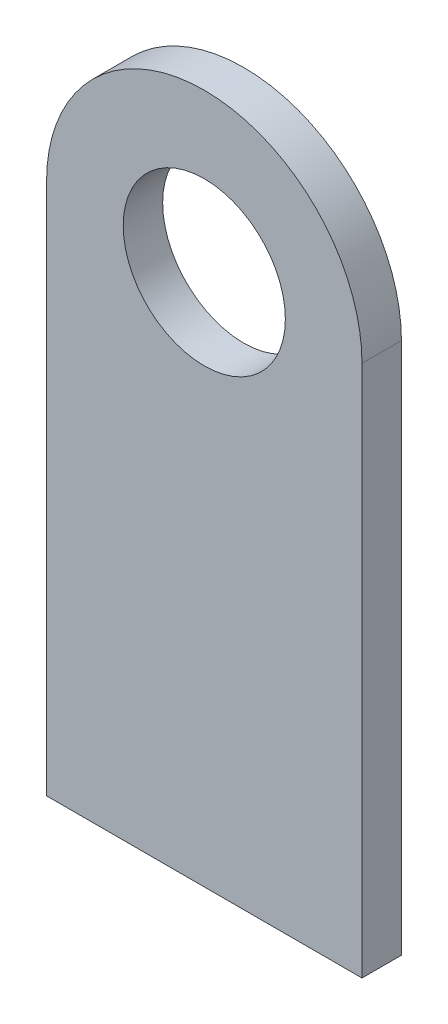
ISO-10303-21;
HEADER;
FILE_DESCRIPTION(('STEP AP214'),'2;1');
FILE_NAME('part.step','',(''),(''),'','','');
FILE_SCHEMA(('AUTOMOTIVE_DESIGN { 1 0 10303 214 1 1 1 1 }'));
ENDSEC;
DATA;
#1=APPLICATION_CONTEXT('core data for automotive mechanical design processes');
#2=APPLICATION_PROTOCOL_DEFINITION('international standard','automotive_design',2000,#1);
#3=PRODUCT_CONTEXT('',#1,'mechanical');
#4=PRODUCT('Part','Part','',(#3));
#5=PRODUCT_RELATED_PRODUCT_CATEGORY('part','',(#4));
#6=PRODUCT_DEFINITION_FORMATION('','',#4);
#7=PRODUCT_DEFINITION_CONTEXT('part definition',#1,'design');
#8=PRODUCT_DEFINITION('design','',#6,#7);
#9=PRODUCT_DEFINITION_SHAPE('','',#8);
#10=(LENGTH_UNIT() NAMED_UNIT(*) SI_UNIT(.MILLI.,.METRE.));
#11=(NAMED_UNIT(*) PLANE_ANGLE_UNIT() SI_UNIT($,.RADIAN.));
#12=(NAMED_UNIT(*) SI_UNIT($,.STERADIAN.) SOLID_ANGLE_UNIT());
#13=UNCERTAINTY_MEASURE_WITH_UNIT(LENGTH_MEASURE(1.E-05),#10,'distance_accuracy_value','');
#14=(GEOMETRIC_REPRESENTATION_CONTEXT(3) GLOBAL_UNCERTAINTY_ASSIGNED_CONTEXT((#13)) GLOBAL_UNIT_ASSIGNED_CONTEXT((#10,
#11,#12)) REPRESENTATION_CONTEXT('',''));
#15=CARTESIAN_POINT('',(0.,0.,0.));
#16=DIRECTION('',(0.,0.,1.));
#17=DIRECTION('',(1.,0.,0.));
#18=AXIS2_PLACEMENT_3D('',#15,#16,#17);
#19=CARTESIAN_POINT('',(0.,0.,1.5875));
#20=DIRECTION('',(0.,0.,1.));
#21=DIRECTION('',(1.,0.,0.));
#22=AXIS2_PLACEMENT_3D('',#19,#20,#21);
#23=PLANE('',#22);
#24=DIRECTION('',(0.,-1.,0.));
#25=VECTOR('',#24,1.);
#26=CARTESIAN_POINT('',(-6.35,0.,1.5875));
#27=LINE('',#26,#25);
#28=CARTESIAN_POINT('',(-6.35,0.,1.5875));
#29=VERTEX_POINT('',#28);
#30=CARTESIAN_POINT('',(-6.35,-21.43125,1.5875));
#31=VERTEX_POINT('',#30);
#32=EDGE_CURVE('E91',#29,#31,#27,.T.);
#33=ORIENTED_EDGE('',*,*,#32,.T.);
#34=DIRECTION('',(1.,0.,0.));
#35=VECTOR('',#34,1.);
#36=CARTESIAN_POINT('',(-6.35,-21.43125,1.5875));
#37=LINE('',#36,#35);
#38=CARTESIAN_POINT('',(6.35,-21.43125,1.5875));
#39=VERTEX_POINT('',#38);
#40=EDGE_CURVE('E86',#31,#39,#37,.T.);
#41=ORIENTED_EDGE('',*,*,#40,.T.);
#42=DIRECTION('',(0.,1.,0.));
#43=VECTOR('',#42,1.);
#44=CARTESIAN_POINT('',(6.35,-21.43125,1.5875));
#45=LINE('',#44,#43);
#46=CARTESIAN_POINT('',(6.35,0.,1.5875));
#47=VERTEX_POINT('',#46);
#48=EDGE_CURVE('E89',#39,#47,#45,.T.);
#49=ORIENTED_EDGE('',*,*,#48,.T.);
#50=CARTESIAN_POINT('',(0.,0.,1.5875));
#51=DIRECTION('',(0.,0.,1.));
#52=DIRECTION('',(1.,0.,0.));
#53=AXIS2_PLACEMENT_3D('',#50,#51,#52);
#54=CIRCLE('',#53,6.35);
#55=EDGE_CURVE('E56',#47,#29,#54,.T.);
#56=ORIENTED_EDGE('',*,*,#55,.T.);
#57=EDGE_LOOP('',(#33,#41,#49,#56));
#58=FACE_BOUND('',#57,.T.);
#59=CARTESIAN_POINT('',(0.,0.,1.5875));
#60=DIRECTION('',(0.,0.,1.));
#61=DIRECTION('',(1.,0.,0.));
#62=AXIS2_PLACEMENT_3D('',#59,#60,#61);
#63=CIRCLE('',#62,3.2639);
#64=CARTESIAN_POINT('',(3.2639,0.,1.5875));
#65=VERTEX_POINT('',#64);
#66=EDGE_CURVE('E106',#65,#65,#63,.T.);
#67=ORIENTED_EDGE('',*,*,#66,.F.);
#68=EDGE_LOOP('',(#67));
#69=FACE_BOUND('',#68,.T.);
#70=ADVANCED_FACE('F39',(#58,#69),#23,.T.);
#71=CARTESIAN_POINT('',(0.,0.,0.));
#72=DIRECTION('',(0.,0.,1.));
#73=DIRECTION('',(1.,0.,0.));
#74=AXIS2_PLACEMENT_3D('',#71,#72,#73);
#75=PLANE('',#74);
#76=DIRECTION('',(0.,-1.,0.));
#77=VECTOR('',#76,1.);
#78=CARTESIAN_POINT('',(-6.35,0.,0.));
#79=LINE('',#78,#77);
#80=CARTESIAN_POINT('',(-6.35,0.,0.));
#81=VERTEX_POINT('',#80);
#82=CARTESIAN_POINT('',(-6.35,-21.43125,0.));
#83=VERTEX_POINT('',#82);
#84=EDGE_CURVE('E103',#81,#83,#79,.T.);
#85=ORIENTED_EDGE('',*,*,#84,.F.);
#86=CARTESIAN_POINT('',(0.,0.,0.));
#87=DIRECTION('',(0.,0.,1.));
#88=DIRECTION('',(1.,0.,0.));
#89=AXIS2_PLACEMENT_3D('',#86,#87,#88);
#90=CIRCLE('',#89,6.35);
#91=CARTESIAN_POINT('',(6.35,0.,0.));
#92=VERTEX_POINT('',#91);
#93=EDGE_CURVE('E79',#92,#81,#90,.T.);
#94=ORIENTED_EDGE('',*,*,#93,.F.);
#95=DIRECTION('',(0.,1.,0.));
#96=VECTOR('',#95,1.);
#97=CARTESIAN_POINT('',(6.35,-21.43125,0.));
#98=LINE('',#97,#96);
#99=CARTESIAN_POINT('',(6.35,-21.43125,0.));
#100=VERTEX_POINT('',#99);
#101=EDGE_CURVE('E73',#100,#92,#98,.T.);
#102=ORIENTED_EDGE('',*,*,#101,.F.);
#103=DIRECTION('',(1.,0.,0.));
#104=VECTOR('',#103,1.);
#105=CARTESIAN_POINT('',(-6.35,-21.43125,0.));
#106=LINE('',#105,#104);
#107=EDGE_CURVE('E95',#83,#100,#106,.T.);
#108=ORIENTED_EDGE('',*,*,#107,.F.);
#109=EDGE_LOOP('',(#85,#94,#102,#108));
#110=FACE_BOUND('',#109,.T.);
#111=CARTESIAN_POINT('',(0.,0.,0.));
#112=DIRECTION('',(0.,0.,1.));
#113=DIRECTION('',(1.,0.,0.));
#114=AXIS2_PLACEMENT_3D('',#111,#112,#113);
#115=CIRCLE('',#114,3.2639);
#116=CARTESIAN_POINT('',(3.2639,0.,0.));
#117=VERTEX_POINT('',#116);
#118=EDGE_CURVE('E118',#117,#117,#115,.T.);
#119=ORIENTED_EDGE('',*,*,#118,.T.);
#120=EDGE_LOOP('',(#119));
#121=FACE_BOUND('',#120,.T.);
#122=ADVANCED_FACE('F114',(#110,#121),#75,.F.);
#123=CARTESIAN_POINT('',(-6.35,0.,1.5875));
#124=DIRECTION('',(1.,0.,0.));
#125=DIRECTION('',(0.,1.,0.));
#126=AXIS2_PLACEMENT_3D('',#123,#124,#125);
#127=PLANE('',#126);
#128=ORIENTED_EDGE('',*,*,#84,.T.);
#129=DIRECTION('',(0.,0.,-1.));
#130=VECTOR('',#129,1.);
#131=CARTESIAN_POINT('',(-6.35,-21.43125,1.5875));
#132=LINE('',#131,#130);
#133=EDGE_CURVE('E11',#31,#83,#132,.T.);
#134=ORIENTED_EDGE('',*,*,#133,.F.);
#135=ORIENTED_EDGE('',*,*,#32,.F.);
#136=DIRECTION('',(0.,0.,-1.));
#137=VECTOR('',#136,1.);
#138=CARTESIAN_POINT('',(-6.35,0.,1.5875));
#139=LINE('',#138,#137);
#140=EDGE_CURVE('E99',#29,#81,#139,.T.);
#141=ORIENTED_EDGE('',*,*,#140,.T.);
#142=EDGE_LOOP('',(#128,#134,#135,#141));
#143=FACE_BOUND('',#142,.T.);
#144=ADVANCED_FACE('F41',(#143),#127,.F.);
#145=CARTESIAN_POINT('',(-6.35,-21.43125,1.5875));
#146=DIRECTION('',(0.,1.,0.));
#147=DIRECTION('',(0.,0.,1.));
#148=AXIS2_PLACEMENT_3D('',#145,#146,#147);
#149=PLANE('',#148);
#150=ORIENTED_EDGE('',*,*,#107,.T.);
#151=DIRECTION('',(0.,0.,-1.));
#152=VECTOR('',#151,1.);
#153=CARTESIAN_POINT('',(6.35,-21.43125,1.5875));
#154=LINE('',#153,#152);
#155=EDGE_CURVE('E48',#39,#100,#154,.T.);
#156=ORIENTED_EDGE('',*,*,#155,.F.);
#157=ORIENTED_EDGE('',*,*,#40,.F.);
#158=ORIENTED_EDGE('',*,*,#133,.T.);
#159=EDGE_LOOP('',(#150,#156,#157,#158));
#160=FACE_BOUND('',#159,.T.);
#161=ADVANCED_FACE('F94',(#160),#149,.F.);
#162=CARTESIAN_POINT('',(6.35,-21.43125,1.5875));
#163=DIRECTION('',(-1.,0.,0.));
#164=DIRECTION('',(0.,0.,1.));
#165=AXIS2_PLACEMENT_3D('',#162,#163,#164);
#166=PLANE('',#165);
#167=ORIENTED_EDGE('',*,*,#101,.T.);
#168=DIRECTION('',(0.,0.,-1.));
#169=VECTOR('',#168,1.);
#170=CARTESIAN_POINT('',(6.35,0.,1.5875));
#171=LINE('',#170,#169);
#172=EDGE_CURVE('E96',#47,#92,#171,.T.);
#173=ORIENTED_EDGE('',*,*,#172,.F.);
#174=ORIENTED_EDGE('',*,*,#48,.F.);
#175=ORIENTED_EDGE('',*,*,#155,.T.);
#176=EDGE_LOOP('',(#167,#173,#174,#175));
#177=FACE_BOUND('',#176,.T.);
#178=ADVANCED_FACE('F97',(#177),#166,.F.);
#179=CARTESIAN_POINT('',(0.,0.,1.5875));
#180=DIRECTION('',(0.,0.,-1.));
#181=DIRECTION('',(-1.,0.,0.));
#182=AXIS2_PLACEMENT_3D('',#179,#180,#181);
#183=CYLINDRICAL_SURFACE('',#182,6.35);
#184=ORIENTED_EDGE('',*,*,#93,.T.);
#185=ORIENTED_EDGE('',*,*,#140,.F.);
#186=ORIENTED_EDGE('',*,*,#55,.F.);
#187=ORIENTED_EDGE('',*,*,#172,.T.);
#188=EDGE_LOOP('',(#184,#185,#186,#187));
#189=FACE_BOUND('',#188,.T.);
#190=ADVANCED_FACE('F111',(#189),#183,.T.);
#191=CARTESIAN_POINT('',(0.,0.,1.5875));
#192=DIRECTION('',(0.,0.,-1.));
#193=DIRECTION('',(-1.,0.,0.));
#194=AXIS2_PLACEMENT_3D('',#191,#192,#193);
#195=CYLINDRICAL_SURFACE('',#194,3.2639);
#196=ORIENTED_EDGE('',*,*,#66,.T.);
#197=EDGE_LOOP('',(#196));
#198=FACE_BOUND('',#197,.T.);
#199=ORIENTED_EDGE('',*,*,#118,.F.);
#200=EDGE_LOOP('',(#199));
#201=FACE_BOUND('',#200,.T.);
#202=ADVANCED_FACE('F124',(#198,#201),#195,.F.);
#203=CLOSED_SHELL('',(#70,#122,#144,#161,#178,#190,#202));
#204=MANIFOLD_SOLID_BREP('B2',#203);
#205=ADVANCED_BREP_SHAPE_REPRESENTATION('',(#18,#204),#14);
#206=SHAPE_DEFINITION_REPRESENTATION(#9,#205);
ENDSEC;
END-ISO-10303-21;
